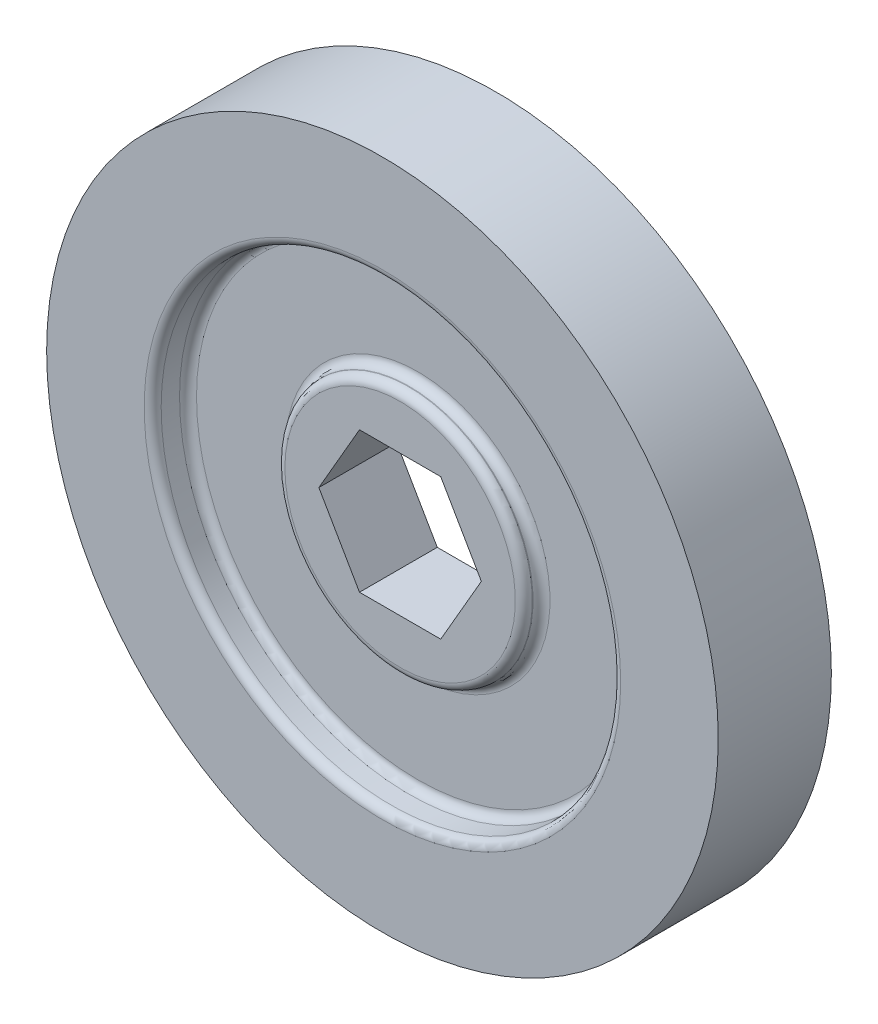
ISO-10303-21;
HEADER;
FILE_DESCRIPTION(('STEP AP214'),'2;1');
FILE_NAME('part.step','',(''),(''),'','','');
FILE_SCHEMA(('AUTOMOTIVE_DESIGN { 1 0 10303 214 1 1 1 1 }'));
ENDSEC;
DATA;
#1=APPLICATION_CONTEXT('core data for automotive mechanical design processes');
#2=APPLICATION_PROTOCOL_DEFINITION('international standard','automotive_design',2000,#1);
#3=PRODUCT_CONTEXT('',#1,'mechanical');
#4=PRODUCT('Part','Part','',(#3));
#5=PRODUCT_RELATED_PRODUCT_CATEGORY('part','',(#4));
#6=PRODUCT_DEFINITION_FORMATION('','',#4);
#7=PRODUCT_DEFINITION_CONTEXT('part definition',#1,'design');
#8=PRODUCT_DEFINITION('design','',#6,#7);
#9=PRODUCT_DEFINITION_SHAPE('','',#8);
#10=(LENGTH_UNIT() NAMED_UNIT(*) SI_UNIT(.MILLI.,.METRE.));
#11=(NAMED_UNIT(*) PLANE_ANGLE_UNIT() SI_UNIT($,.RADIAN.));
#12=(NAMED_UNIT(*) SI_UNIT($,.STERADIAN.) SOLID_ANGLE_UNIT());
#13=UNCERTAINTY_MEASURE_WITH_UNIT(LENGTH_MEASURE(1.E-05),#10,'distance_accuracy_value','');
#14=(GEOMETRIC_REPRESENTATION_CONTEXT(3) GLOBAL_UNCERTAINTY_ASSIGNED_CONTEXT((#13)) GLOBAL_UNIT_ASSIGNED_CONTEXT((#10,
#11,#12)) REPRESENTATION_CONTEXT('',''));
#15=CARTESIAN_POINT('',(0.,0.,0.));
#16=DIRECTION('',(0.,0.,1.));
#17=DIRECTION('',(1.,0.,0.));
#18=AXIS2_PLACEMENT_3D('',#15,#16,#17);
#19=CARTESIAN_POINT('',(0.,0.,-5.08));
#20=DIRECTION('',(0.,0.,1.));
#21=DIRECTION('',(1.,0.,0.));
#22=AXIS2_PLACEMENT_3D('',#19,#20,#21);
#23=CYLINDRICAL_SURFACE('',#22,30.1625);
#24=CARTESIAN_POINT('',(0.,0.,-5.08));
#25=DIRECTION('',(0.,0.,1.));
#26=DIRECTION('',(1.,0.,0.));
#27=AXIS2_PLACEMENT_3D('',#24,#25,#26);
#28=CIRCLE('',#27,30.1625);
#29=CARTESIAN_POINT('',(30.1625,0.,-5.08));
#30=VERTEX_POINT('',#29);
#31=EDGE_CURVE('E120',#30,#30,#28,.T.);
#32=ORIENTED_EDGE('',*,*,#31,.T.);
#33=EDGE_LOOP('',(#32));
#34=FACE_BOUND('',#33,.T.);
#35=CARTESIAN_POINT('',(0.,0.,5.08));
#36=DIRECTION('',(0.,0.,1.));
#37=DIRECTION('',(1.,0.,0.));
#38=AXIS2_PLACEMENT_3D('',#35,#36,#37);
#39=CIRCLE('',#38,30.1625);
#40=CARTESIAN_POINT('',(30.1625,0.,5.08));
#41=VERTEX_POINT('',#40);
#42=EDGE_CURVE('E117',#41,#41,#39,.T.);
#43=ORIENTED_EDGE('',*,*,#42,.F.);
#44=EDGE_LOOP('',(#43));
#45=FACE_BOUND('',#44,.T.);
#46=ADVANCED_FACE('F35',(#34,#45),#23,.T.);
#47=CARTESIAN_POINT('',(0.,0.,-5.08));
#48=DIRECTION('',(0.,0.,1.));
#49=DIRECTION('',(1.,0.,0.));
#50=AXIS2_PLACEMENT_3D('',#47,#48,#49);
#51=PLANE('',#50);
#52=CARTESIAN_POINT('',(0.,0.,-5.08));
#53=DIRECTION('',(0.,0.,1.));
#54=DIRECTION('',(1.,0.,0.));
#55=AXIS2_PLACEMENT_3D('',#52,#53,#54);
#56=CIRCLE('',#55,21.3995);
#57=CARTESIAN_POINT('',(21.3995,0.,-5.08));
#58=VERTEX_POINT('',#57);
#59=EDGE_CURVE('E136',#58,#58,#56,.T.);
#60=ORIENTED_EDGE('',*,*,#59,.T.);
#61=EDGE_LOOP('',(#60));
#62=FACE_BOUND('',#61,.T.);
#63=ORIENTED_EDGE('',*,*,#31,.F.);
#64=EDGE_LOOP('',(#63));
#65=FACE_BOUND('',#64,.T.);
#66=ADVANCED_FACE('F185',(#62,#65),#51,.F.);
#67=CARTESIAN_POINT('',(0.,0.,5.08));
#68=DIRECTION('',(0.,0.,1.));
#69=DIRECTION('',(1.,0.,0.));
#70=AXIS2_PLACEMENT_3D('',#67,#68,#69);
#71=PLANE('',#70);
#72=CARTESIAN_POINT('',(0.,0.,5.08));
#73=DIRECTION('',(0.,0.,1.));
#74=DIRECTION('',(1.,0.,0.));
#75=AXIS2_PLACEMENT_3D('',#72,#73,#74);
#76=CIRCLE('',#75,21.3995);
#77=CARTESIAN_POINT('',(21.3995,0.,5.08));
#78=VERTEX_POINT('',#77);
#79=EDGE_CURVE('E94',#78,#78,#76,.F.);
#80=ORIENTED_EDGE('',*,*,#79,.T.);
#81=EDGE_LOOP('',(#80));
#82=FACE_BOUND('',#81,.T.);
#83=ORIENTED_EDGE('',*,*,#42,.T.);
#84=EDGE_LOOP('',(#83));
#85=FACE_BOUND('',#84,.T.);
#86=ADVANCED_FACE('F191',(#82,#85),#71,.T.);
#87=CARTESIAN_POINT('',(7.29770740255687,0.,-5.08));
#88=DIRECTION('',(0.866025403784438,0.5,0.));
#89=DIRECTION('',(-0.5,0.866025403784438,0.));
#90=AXIS2_PLACEMENT_3D('',#87,#88,#89);
#91=PLANE('',#90);
#92=DIRECTION('',(0.,0.,1.));
#93=VECTOR('',#92,1.);
#94=CARTESIAN_POINT('',(7.29770740255687,0.,-5.08));
#95=LINE('',#94,#93);
#96=CARTESIAN_POINT('',(7.29770740255687,0.,-3.4925));
#97=VERTEX_POINT('',#96);
#98=CARTESIAN_POINT('',(7.29770740255687,0.,3.4925));
#99=VERTEX_POINT('',#98);
#100=EDGE_CURVE('E103',#97,#99,#95,.T.);
#101=ORIENTED_EDGE('',*,*,#100,.T.);
#102=DIRECTION('',(-0.5,0.866025403784438,0.));
#103=VECTOR('',#102,1.);
#104=CARTESIAN_POINT('',(7.29770740255687,0.,3.4925));
#105=LINE('',#104,#103);
#106=CARTESIAN_POINT('',(3.64885370127844,6.32,3.4925));
#107=VERTEX_POINT('',#106);
#108=EDGE_CURVE('E88',#99,#107,#105,.T.);
#109=ORIENTED_EDGE('',*,*,#108,.T.);
#110=DIRECTION('',(0.,0.,1.));
#111=VECTOR('',#110,1.);
#112=CARTESIAN_POINT('',(3.64885370127844,6.32,-5.08));
#113=LINE('',#112,#111);
#114=CARTESIAN_POINT('',(3.64885370127844,6.32,-3.4925));
#115=VERTEX_POINT('',#114);
#116=EDGE_CURVE('E101',#115,#107,#113,.T.);
#117=ORIENTED_EDGE('',*,*,#116,.F.);
#118=DIRECTION('',(0.5,-0.866025403784438,0.));
#119=VECTOR('',#118,1.);
#120=CARTESIAN_POINT('',(7.29770740255687,0.,-3.4925));
#121=LINE('',#120,#119);
#122=EDGE_CURVE('E58',#115,#97,#121,.T.);
#123=ORIENTED_EDGE('',*,*,#122,.T.);
#124=EDGE_LOOP('',(#101,#109,#117,#123));
#125=FACE_BOUND('',#124,.T.);
#126=ADVANCED_FACE('F100',(#125),#91,.F.);
#127=CARTESIAN_POINT('',(3.64885370127844,-6.32,-5.08));
#128=DIRECTION('',(0.866025403784439,-0.5,0.));
#129=DIRECTION('',(0.5,0.866025403784439,0.));
#130=AXIS2_PLACEMENT_3D('',#127,#128,#129);
#131=PLANE('',#130);
#132=DIRECTION('',(0.,0.,1.));
#133=VECTOR('',#132,1.);
#134=CARTESIAN_POINT('',(3.64885370127844,-6.32,-5.08));
#135=LINE('',#134,#133);
#136=CARTESIAN_POINT('',(3.64885370127844,-6.32,-3.4925));
#137=VERTEX_POINT('',#136);
#138=CARTESIAN_POINT('',(3.64885370127844,-6.32,3.4925));
#139=VERTEX_POINT('',#138);
#140=EDGE_CURVE('E410',#137,#139,#135,.T.);
#141=ORIENTED_EDGE('',*,*,#140,.T.);
#142=DIRECTION('',(0.5,0.866025403784439,0.));
#143=VECTOR('',#142,1.);
#144=CARTESIAN_POINT('',(3.64885370127844,-6.32,3.4925));
#145=LINE('',#144,#143);
#146=EDGE_CURVE('E105',#139,#99,#145,.T.);
#147=ORIENTED_EDGE('',*,*,#146,.T.);
#148=ORIENTED_EDGE('',*,*,#100,.F.);
#149=DIRECTION('',(-0.5,-0.866025403784439,0.));
#150=VECTOR('',#149,1.);
#151=CARTESIAN_POINT('',(3.64885370127844,-6.32,-3.4925));
#152=LINE('',#151,#150);
#153=EDGE_CURVE('E113',#97,#137,#152,.T.);
#154=ORIENTED_EDGE('',*,*,#153,.T.);
#155=EDGE_LOOP('',(#141,#147,#148,#154));
#156=FACE_BOUND('',#155,.T.);
#157=ADVANCED_FACE('F350',(#156),#131,.F.);
#158=CARTESIAN_POINT('',(-3.64885370127843,-6.32,-5.08));
#159=DIRECTION('',(0.,-1.,0.));
#160=DIRECTION('',(1.,0.,0.));
#161=AXIS2_PLACEMENT_3D('',#158,#159,#160);
#162=PLANE('',#161);
#163=DIRECTION('',(0.,0.,1.));
#164=VECTOR('',#163,1.);
#165=CARTESIAN_POINT('',(-3.64885370127843,-6.32,-5.08));
#166=LINE('',#165,#164);
#167=CARTESIAN_POINT('',(-3.64885370127843,-6.32,-3.4925));
#168=VERTEX_POINT('',#167);
#169=CARTESIAN_POINT('',(-3.64885370127843,-6.32,3.4925));
#170=VERTEX_POINT('',#169);
#171=EDGE_CURVE('E413',#168,#170,#166,.T.);
#172=ORIENTED_EDGE('',*,*,#171,.T.);
#173=DIRECTION('',(1.,0.,0.));
#174=VECTOR('',#173,1.);
#175=CARTESIAN_POINT('',(-3.64885370127843,-6.32,3.4925));
#176=LINE('',#175,#174);
#177=EDGE_CURVE('E428',#170,#139,#176,.T.);
#178=ORIENTED_EDGE('',*,*,#177,.T.);
#179=ORIENTED_EDGE('',*,*,#140,.F.);
#180=DIRECTION('',(-1.,0.,0.));
#181=VECTOR('',#180,1.);
#182=CARTESIAN_POINT('',(-3.64885370127843,-6.32,-3.4925));
#183=LINE('',#182,#181);
#184=EDGE_CURVE('E437',#137,#168,#183,.T.);
#185=ORIENTED_EDGE('',*,*,#184,.T.);
#186=EDGE_LOOP('',(#172,#178,#179,#185));
#187=FACE_BOUND('',#186,.T.);
#188=ADVANCED_FACE('F341',(#187),#162,.F.);
#189=CARTESIAN_POINT('',(-7.29770740255687,0.,-5.08));
#190=DIRECTION('',(-0.866025403784439,-0.5,0.));
#191=DIRECTION('',(0.5,-0.866025403784439,0.));
#192=AXIS2_PLACEMENT_3D('',#189,#190,#191);
#193=PLANE('',#192);
#194=DIRECTION('',(0.,0.,1.));
#195=VECTOR('',#194,1.);
#196=CARTESIAN_POINT('',(-7.29770740255687,0.,-5.08));
#197=LINE('',#196,#195);
#198=CARTESIAN_POINT('',(-7.29770740255687,0.,-3.4925));
#199=VERTEX_POINT('',#198);
#200=CARTESIAN_POINT('',(-7.29770740255687,0.,3.4925));
#201=VERTEX_POINT('',#200);
#202=EDGE_CURVE('E111',#199,#201,#197,.T.);
#203=ORIENTED_EDGE('',*,*,#202,.T.);
#204=DIRECTION('',(0.5,-0.866025403784439,0.));
#205=VECTOR('',#204,1.);
#206=CARTESIAN_POINT('',(-7.29770740255687,0.,3.4925));
#207=LINE('',#206,#205);
#208=EDGE_CURVE('E423',#201,#170,#207,.T.);
#209=ORIENTED_EDGE('',*,*,#208,.T.);
#210=ORIENTED_EDGE('',*,*,#171,.F.);
#211=DIRECTION('',(-0.5,0.866025403784439,0.));
#212=VECTOR('',#211,1.);
#213=CARTESIAN_POINT('',(-7.29770740255687,0.,-3.4925));
#214=LINE('',#213,#212);
#215=EDGE_CURVE('E424',#168,#199,#214,.T.);
#216=ORIENTED_EDGE('',*,*,#215,.T.);
#217=EDGE_LOOP('',(#203,#209,#210,#216));
#218=FACE_BOUND('',#217,.T.);
#219=ADVANCED_FACE('F332',(#218),#193,.F.);
#220=CARTESIAN_POINT('',(-3.64885370127843,6.32,-5.08));
#221=DIRECTION('',(-0.866025403784439,0.5,0.));
#222=DIRECTION('',(-0.5,-0.866025403784439,0.));
#223=AXIS2_PLACEMENT_3D('',#220,#221,#222);
#224=PLANE('',#223);
#225=DIRECTION('',(0.,0.,1.));
#226=VECTOR('',#225,1.);
#227=CARTESIAN_POINT('',(-3.64885370127843,6.32,-5.08));
#228=LINE('',#227,#226);
#229=CARTESIAN_POINT('',(-3.64885370127844,6.32,-3.4925));
#230=VERTEX_POINT('',#229);
#231=CARTESIAN_POINT('',(-3.64885370127843,6.32,3.4925));
#232=VERTEX_POINT('',#231);
#233=EDGE_CURVE('E109',#230,#232,#228,.T.);
#234=ORIENTED_EDGE('',*,*,#233,.T.);
#235=DIRECTION('',(-0.5,-0.866025403784439,0.));
#236=VECTOR('',#235,1.);
#237=CARTESIAN_POINT('',(-3.64885370127843,6.32,3.4925));
#238=LINE('',#237,#236);
#239=EDGE_CURVE('E50',#232,#201,#238,.T.);
#240=ORIENTED_EDGE('',*,*,#239,.T.);
#241=ORIENTED_EDGE('',*,*,#202,.F.);
#242=DIRECTION('',(0.5,0.866025403784439,0.));
#243=VECTOR('',#242,1.);
#244=CARTESIAN_POINT('',(-3.64885370127843,6.32,-3.4925));
#245=LINE('',#244,#243);
#246=EDGE_CURVE('E426',#199,#230,#245,.T.);
#247=ORIENTED_EDGE('',*,*,#246,.T.);
#248=EDGE_LOOP('',(#234,#240,#241,#247));
#249=FACE_BOUND('',#248,.T.);
#250=ADVANCED_FACE('F324',(#249),#224,.F.);
#251=CARTESIAN_POINT('',(3.64885370127844,6.32,-5.08));
#252=DIRECTION('',(0.,1.,0.));
#253=DIRECTION('',(-1.,0.,0.));
#254=AXIS2_PLACEMENT_3D('',#251,#252,#253);
#255=PLANE('',#254);
#256=ORIENTED_EDGE('',*,*,#116,.T.);
#257=DIRECTION('',(-1.,0.,0.));
#258=VECTOR('',#257,1.);
#259=CARTESIAN_POINT('',(3.64885370127844,6.32,3.4925));
#260=LINE('',#259,#258);
#261=EDGE_CURVE('E85',#107,#232,#260,.T.);
#262=ORIENTED_EDGE('',*,*,#261,.T.);
#263=ORIENTED_EDGE('',*,*,#233,.F.);
#264=DIRECTION('',(1.,0.,0.));
#265=VECTOR('',#264,1.);
#266=CARTESIAN_POINT('',(3.64885370127844,6.32,-3.4925));
#267=LINE('',#266,#265);
#268=EDGE_CURVE('E108',#230,#115,#267,.T.);
#269=ORIENTED_EDGE('',*,*,#268,.T.);
#270=EDGE_LOOP('',(#256,#262,#263,#269));
#271=FACE_BOUND('',#270,.T.);
#272=ADVANCED_FACE('F107',(#271),#255,.F.);
#273=CARTESIAN_POINT('',(0.,0.,-3.4925));
#274=DIRECTION('',(0.,0.,1.));
#275=DIRECTION('',(1.,0.,0.));
#276=AXIS2_PLACEMENT_3D('',#273,#274,#275);
#277=PLANE('',#276);
#278=CARTESIAN_POINT('',(0.,0.,-3.4925));
#279=DIRECTION('',(0.,0.,1.));
#280=DIRECTION('',(1.,0.,0.));
#281=AXIS2_PLACEMENT_3D('',#278,#279,#280);
#282=CIRCLE('',#281,10.3505);
#283=CARTESIAN_POINT('',(10.3505,0.,-3.4925));
#284=VERTEX_POINT('',#283);
#285=EDGE_CURVE('E95',#284,#284,#282,.F.);
#286=ORIENTED_EDGE('',*,*,#285,.T.);
#287=EDGE_LOOP('',(#286));
#288=FACE_BOUND('',#287,.T.);
#289=ORIENTED_EDGE('',*,*,#268,.F.);
#290=ORIENTED_EDGE('',*,*,#246,.F.);
#291=ORIENTED_EDGE('',*,*,#215,.F.);
#292=ORIENTED_EDGE('',*,*,#184,.F.);
#293=ORIENTED_EDGE('',*,*,#153,.F.);
#294=ORIENTED_EDGE('',*,*,#122,.F.);
#295=EDGE_LOOP('',(#289,#290,#291,#292,#293,#294));
#296=FACE_BOUND('',#295,.T.);
#297=ADVANCED_FACE('F306',(#288,#296),#277,.F.);
#298=CARTESIAN_POINT('',(0.,11.1125,-1.905));
#299=DIRECTION('',(0.,0.,1.));
#300=DIRECTION('',(1.,0.,0.));
#301=AXIS2_PLACEMENT_3D('',#298,#299,#300);
#302=PLANE('',#301);
#303=CARTESIAN_POINT('',(0.,0.,-1.905));
#304=DIRECTION('',(0.,0.,1.));
#305=DIRECTION('',(1.,0.,0.));
#306=AXIS2_PLACEMENT_3D('',#303,#304,#305);
#307=CIRCLE('',#306,11.8745);
#308=CARTESIAN_POINT('',(11.8745,0.,-1.905));
#309=VERTEX_POINT('',#308);
#310=EDGE_CURVE('E130',#309,#309,#307,.T.);
#311=ORIENTED_EDGE('',*,*,#310,.T.);
#312=EDGE_LOOP('',(#311));
#313=FACE_BOUND('',#312,.T.);
#314=CARTESIAN_POINT('',(0.,0.,-1.905));
#315=DIRECTION('',(0.,0.,-1.));
#316=DIRECTION('',(-1.,0.,0.));
#317=AXIS2_PLACEMENT_3D('',#314,#315,#316);
#318=CIRCLE('',#317,20.6375);
#319=CARTESIAN_POINT('',(-20.6375,0.,-1.905));
#320=VERTEX_POINT('',#319);
#321=EDGE_CURVE('E104',#320,#320,#318,.T.);
#322=ORIENTED_EDGE('',*,*,#321,.T.);
#323=EDGE_LOOP('',(#322));
#324=FACE_BOUND('',#323,.T.);
#325=ADVANCED_FACE('F297',(#313,#324),#302,.F.);
#326=CARTESIAN_POINT('',(0.,0.,-22.7530353955303));
#327=DIRECTION('',(0.,0.,-1.));
#328=DIRECTION('',(-1.,0.,0.));
#329=AXIS2_PLACEMENT_3D('',#326,#327,#328);
#330=CYLINDRICAL_SURFACE('',#329,20.6375);
#331=CARTESIAN_POINT('',(0.,0.,-4.318));
#332=DIRECTION('',(0.,0.,1.));
#333=DIRECTION('',(1.,0.,0.));
#334=AXIS2_PLACEMENT_3D('',#331,#332,#333);
#335=CIRCLE('',#334,20.6375);
#336=CARTESIAN_POINT('',(20.6375,0.,-4.318));
#337=VERTEX_POINT('',#336);
#338=EDGE_CURVE('E133',#337,#337,#335,.F.);
#339=ORIENTED_EDGE('',*,*,#338,.T.);
#340=EDGE_LOOP('',(#339));
#341=FACE_BOUND('',#340,.T.);
#342=ORIENTED_EDGE('',*,*,#321,.F.);
#343=EDGE_LOOP('',(#342));
#344=FACE_BOUND('',#343,.T.);
#345=ADVANCED_FACE('F289',(#341,#344),#330,.F.);
#346=CARTESIAN_POINT('',(0.,0.,-22.7530353955303));
#347=DIRECTION('',(0.,0.,-1.));
#348=DIRECTION('',(-1.,0.,0.));
#349=AXIS2_PLACEMENT_3D('',#346,#347,#348);
#350=CYLINDRICAL_SURFACE('',#349,11.1125);
#351=CARTESIAN_POINT('',(0.,0.,-2.667));
#352=DIRECTION('',(0.,0.,1.));
#353=DIRECTION('',(1.,0.,0.));
#354=AXIS2_PLACEMENT_3D('',#351,#352,#353);
#355=CIRCLE('',#354,11.1125);
#356=CARTESIAN_POINT('',(11.1125,0.,-2.667));
#357=VERTEX_POINT('',#356);
#358=EDGE_CURVE('E127',#357,#357,#355,.F.);
#359=ORIENTED_EDGE('',*,*,#358,.T.);
#360=EDGE_LOOP('',(#359));
#361=FACE_BOUND('',#360,.T.);
#362=CARTESIAN_POINT('',(0.,0.,-2.7305));
#363=DIRECTION('',(0.,0.,1.));
#364=DIRECTION('',(1.,0.,0.));
#365=AXIS2_PLACEMENT_3D('',#362,#363,#364);
#366=CIRCLE('',#365,11.1125);
#367=CARTESIAN_POINT('',(11.1125,0.,-2.7305));
#368=VERTEX_POINT('',#367);
#369=EDGE_CURVE('E124',#368,#368,#366,.T.);
#370=ORIENTED_EDGE('',*,*,#369,.T.);
#371=EDGE_LOOP('',(#370));
#372=FACE_BOUND('',#371,.T.);
#373=ADVANCED_FACE('F201',(#361,#372),#350,.T.);
#374=CARTESIAN_POINT('',(0.,0.,-2.667));
#375=DIRECTION('',(0.,0.,1.));
#376=DIRECTION('',(1.,0.,0.));
#377=AXIS2_PLACEMENT_3D('',#374,#375,#376);
#378=TOROIDAL_SURFACE('',#377,11.8745,0.762);
#379=ORIENTED_EDGE('',*,*,#310,.F.);
#380=EDGE_LOOP('',(#379));
#381=FACE_BOUND('',#380,.T.);
#382=ORIENTED_EDGE('',*,*,#358,.F.);
#383=EDGE_LOOP('',(#382));
#384=FACE_BOUND('',#383,.T.);
#385=ADVANCED_FACE('F197',(#381,#384),#378,.F.);
#386=CARTESIAN_POINT('',(0.,0.,-4.318));
#387=DIRECTION('',(0.,0.,1.));
#388=DIRECTION('',(1.,0.,0.));
#389=AXIS2_PLACEMENT_3D('',#386,#387,#388);
#390=TOROIDAL_SURFACE('',#389,21.3995,0.762);
#391=ORIENTED_EDGE('',*,*,#59,.F.);
#392=EDGE_LOOP('',(#391));
#393=FACE_BOUND('',#392,.T.);
#394=ORIENTED_EDGE('',*,*,#338,.F.);
#395=EDGE_LOOP('',(#394));
#396=FACE_BOUND('',#395,.T.);
#397=ADVANCED_FACE('F200',(#393,#396),#390,.T.);
#398=CARTESIAN_POINT('',(0.,0.,-2.7305));
#399=DIRECTION('',(0.,0.,1.));
#400=DIRECTION('',(1.,0.,0.));
#401=AXIS2_PLACEMENT_3D('',#398,#399,#400);
#402=TOROIDAL_SURFACE('',#401,10.3505,0.762);
#403=ORIENTED_EDGE('',*,*,#369,.F.);
#404=EDGE_LOOP('',(#403));
#405=FACE_BOUND('',#404,.T.);
#406=ORIENTED_EDGE('',*,*,#285,.F.);
#407=EDGE_LOOP('',(#406));
#408=FACE_BOUND('',#407,.T.);
#409=ADVANCED_FACE('F180',(#405,#408),#402,.T.);
#410=CARTESIAN_POINT('',(0.,0.,3.4925));
#411=DIRECTION('',(0.,0.,-1.));
#412=DIRECTION('',(1.,0.,0.));
#413=AXIS2_PLACEMENT_3D('',#410,#411,#412);
#414=PLANE('',#413);
#415=CARTESIAN_POINT('',(0.,0.,3.4925));
#416=DIRECTION('',(0.,0.,-1.));
#417=DIRECTION('',(-1.,0.,0.));
#418=AXIS2_PLACEMENT_3D('',#415,#416,#417);
#419=CIRCLE('',#418,10.3505);
#420=CARTESIAN_POINT('',(-10.3505,0.,3.4925));
#421=VERTEX_POINT('',#420);
#422=EDGE_CURVE('E11',#421,#421,#419,.F.);
#423=ORIENTED_EDGE('',*,*,#422,.T.);
#424=EDGE_LOOP('',(#423));
#425=FACE_BOUND('',#424,.T.);
#426=ORIENTED_EDGE('',*,*,#146,.F.);
#427=ORIENTED_EDGE('',*,*,#177,.F.);
#428=ORIENTED_EDGE('',*,*,#208,.F.);
#429=ORIENTED_EDGE('',*,*,#239,.F.);
#430=ORIENTED_EDGE('',*,*,#261,.F.);
#431=ORIENTED_EDGE('',*,*,#108,.F.);
#432=EDGE_LOOP('',(#426,#427,#428,#429,#430,#431));
#433=FACE_BOUND('',#432,.T.);
#434=ADVANCED_FACE('F87',(#425,#433),#414,.F.);
#435=CARTESIAN_POINT('',(0.,11.1125,1.905));
#436=DIRECTION('',(0.,0.,-1.));
#437=DIRECTION('',(1.,0.,0.));
#438=AXIS2_PLACEMENT_3D('',#435,#436,#437);
#439=PLANE('',#438);
#440=CARTESIAN_POINT('',(0.,0.,1.905));
#441=DIRECTION('',(0.,0.,-1.));
#442=DIRECTION('',(-1.,0.,0.));
#443=AXIS2_PLACEMENT_3D('',#440,#441,#442);
#444=CIRCLE('',#443,19.8755);
#445=CARTESIAN_POINT('',(-19.8755,0.,1.905));
#446=VERTEX_POINT('',#445);
#447=EDGE_CURVE('E152',#446,#446,#444,.F.);
#448=ORIENTED_EDGE('',*,*,#447,.T.);
#449=EDGE_LOOP('',(#448));
#450=FACE_BOUND('',#449,.T.);
#451=CARTESIAN_POINT('',(0.,0.,1.905));
#452=DIRECTION('',(0.,0.,-1.));
#453=DIRECTION('',(-1.,0.,0.));
#454=AXIS2_PLACEMENT_3D('',#451,#452,#453);
#455=CIRCLE('',#454,11.8745);
#456=CARTESIAN_POINT('',(-11.8745,0.,1.905));
#457=VERTEX_POINT('',#456);
#458=EDGE_CURVE('E149',#457,#457,#455,.T.);
#459=ORIENTED_EDGE('',*,*,#458,.T.);
#460=EDGE_LOOP('',(#459));
#461=FACE_BOUND('',#460,.T.);
#462=ADVANCED_FACE('F169',(#450,#461),#439,.F.);
#463=CARTESIAN_POINT('',(0.,0.,22.7530353955303));
#464=DIRECTION('',(0.,0.,1.));
#465=DIRECTION('',(-1.,0.,0.));
#466=AXIS2_PLACEMENT_3D('',#463,#464,#465);
#467=CYLINDRICAL_SURFACE('',#466,20.6375);
#468=CARTESIAN_POINT('',(0.,0.,4.318));
#469=DIRECTION('',(0.,0.,1.));
#470=DIRECTION('',(1.,0.,0.));
#471=AXIS2_PLACEMENT_3D('',#468,#469,#470);
#472=CIRCLE('',#471,20.6375);
#473=CARTESIAN_POINT('',(20.6375,0.,4.318));
#474=VERTEX_POINT('',#473);
#475=EDGE_CURVE('E146',#474,#474,#472,.T.);
#476=ORIENTED_EDGE('',*,*,#475,.T.);
#477=EDGE_LOOP('',(#476));
#478=FACE_BOUND('',#477,.T.);
#479=CARTESIAN_POINT('',(0.,0.,2.667));
#480=DIRECTION('',(0.,0.,-1.));
#481=DIRECTION('',(-1.,0.,0.));
#482=AXIS2_PLACEMENT_3D('',#479,#480,#481);
#483=CIRCLE('',#482,20.6375);
#484=CARTESIAN_POINT('',(-20.6375,0.,2.667));
#485=VERTEX_POINT('',#484);
#486=EDGE_CURVE('E143',#485,#485,#483,.T.);
#487=ORIENTED_EDGE('',*,*,#486,.T.);
#488=EDGE_LOOP('',(#487));
#489=FACE_BOUND('',#488,.T.);
#490=ADVANCED_FACE('F171',(#478,#489),#467,.F.);
#491=CARTESIAN_POINT('',(0.,0.,22.7530353955303));
#492=DIRECTION('',(0.,0.,1.));
#493=DIRECTION('',(-1.,0.,0.));
#494=AXIS2_PLACEMENT_3D('',#491,#492,#493);
#495=CYLINDRICAL_SURFACE('',#494,11.1125);
#496=CARTESIAN_POINT('',(0.,0.,2.667));
#497=DIRECTION('',(0.,0.,-1.));
#498=DIRECTION('',(-1.,0.,0.));
#499=AXIS2_PLACEMENT_3D('',#496,#497,#498);
#500=CIRCLE('',#499,11.1125);
#501=CARTESIAN_POINT('',(-11.1125,0.,2.667));
#502=VERTEX_POINT('',#501);
#503=EDGE_CURVE('E43',#502,#502,#500,.F.);
#504=ORIENTED_EDGE('',*,*,#503,.T.);
#505=EDGE_LOOP('',(#504));
#506=FACE_BOUND('',#505,.T.);
#507=CARTESIAN_POINT('',(0.,0.,2.7305));
#508=DIRECTION('',(0.,0.,-1.));
#509=DIRECTION('',(-1.,0.,0.));
#510=AXIS2_PLACEMENT_3D('',#507,#508,#509);
#511=CIRCLE('',#510,11.1125);
#512=CARTESIAN_POINT('',(-11.1125,0.,2.7305));
#513=VERTEX_POINT('',#512);
#514=EDGE_CURVE('E155',#513,#513,#511,.T.);
#515=ORIENTED_EDGE('',*,*,#514,.T.);
#516=EDGE_LOOP('',(#515));
#517=FACE_BOUND('',#516,.T.);
#518=ADVANCED_FACE('F160',(#506,#517),#495,.T.);
#519=CARTESIAN_POINT('',(0.,0.,4.318));
#520=DIRECTION('',(0.,0.,1.));
#521=DIRECTION('',(1.,0.,0.));
#522=AXIS2_PLACEMENT_3D('',#519,#520,#521);
#523=TOROIDAL_SURFACE('',#522,21.3995,0.762);
#524=ORIENTED_EDGE('',*,*,#475,.F.);
#525=EDGE_LOOP('',(#524));
#526=FACE_BOUND('',#525,.T.);
#527=ORIENTED_EDGE('',*,*,#79,.F.);
#528=EDGE_LOOP('',(#527));
#529=FACE_BOUND('',#528,.T.);
#530=ADVANCED_FACE('F209',(#526,#529),#523,.T.);
#531=CARTESIAN_POINT('',(0.,0.,2.667));
#532=DIRECTION('',(0.,0.,-1.));
#533=DIRECTION('',(-1.,0.,0.));
#534=AXIS2_PLACEMENT_3D('',#531,#532,#533);
#535=TOROIDAL_SURFACE('',#534,19.8755,0.762);
#536=ORIENTED_EDGE('',*,*,#447,.F.);
#537=EDGE_LOOP('',(#536));
#538=FACE_BOUND('',#537,.T.);
#539=ORIENTED_EDGE('',*,*,#486,.F.);
#540=EDGE_LOOP('',(#539));
#541=FACE_BOUND('',#540,.T.);
#542=ADVANCED_FACE('F166',(#538,#541),#535,.F.);
#543=CARTESIAN_POINT('',(0.,0.,2.667));
#544=DIRECTION('',(0.,0.,-1.));
#545=DIRECTION('',(-1.,0.,0.));
#546=AXIS2_PLACEMENT_3D('',#543,#544,#545);
#547=TOROIDAL_SURFACE('',#546,11.8745,0.762);
#548=ORIENTED_EDGE('',*,*,#503,.F.);
#549=EDGE_LOOP('',(#548));
#550=FACE_BOUND('',#549,.T.);
#551=ORIENTED_EDGE('',*,*,#458,.F.);
#552=EDGE_LOOP('',(#551));
#553=FACE_BOUND('',#552,.T.);
#554=ADVANCED_FACE('F163',(#550,#553),#547,.F.);
#555=CARTESIAN_POINT('',(0.,0.,2.7305));
#556=DIRECTION('',(0.,0.,-1.));
#557=DIRECTION('',(-1.,0.,0.));
#558=AXIS2_PLACEMENT_3D('',#555,#556,#557);
#559=TOROIDAL_SURFACE('',#558,10.3505,0.762);
#560=ORIENTED_EDGE('',*,*,#422,.F.);
#561=EDGE_LOOP('',(#560));
#562=FACE_BOUND('',#561,.T.);
#563=ORIENTED_EDGE('',*,*,#514,.F.);
#564=EDGE_LOOP('',(#563));
#565=FACE_BOUND('',#564,.T.);
#566=ADVANCED_FACE('F37',(#562,#565),#559,.T.);
#567=CLOSED_SHELL('',(#46,#66,#86,#126,#157,#188,#219,#250,#272,#297,#325,#345,#373,#385,#397,
#409,#434,#462,#490,#518,#530,#542,#554,#566));
#568=MANIFOLD_SOLID_BREP('B2',#567);
#569=ADVANCED_BREP_SHAPE_REPRESENTATION('',(#18,#568),#14);
#570=SHAPE_DEFINITION_REPRESENTATION(#9,#569);
ENDSEC;
END-ISO-10303-21;
